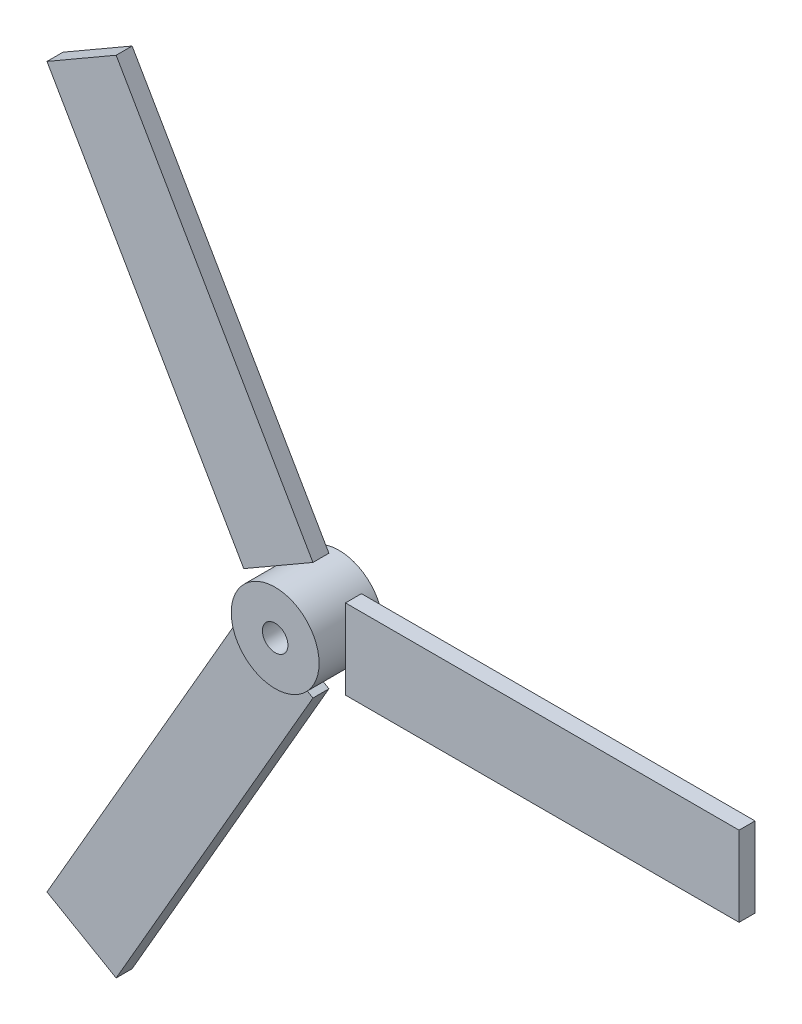
ISO-10303-21;
HEADER;
FILE_DESCRIPTION(('STEP AP214'),'2;1');
FILE_NAME('part.step','',(''),(''),'','','');
FILE_SCHEMA(('AUTOMOTIVE_DESIGN { 1 0 10303 214 1 1 1 1 }'));
ENDSEC;
DATA;
#1=APPLICATION_CONTEXT('core data for automotive mechanical design processes');
#2=APPLICATION_PROTOCOL_DEFINITION('international standard','automotive_design',2000,#1);
#3=PRODUCT_CONTEXT('',#1,'mechanical');
#4=PRODUCT('Part','Part','',(#3));
#5=PRODUCT_RELATED_PRODUCT_CATEGORY('part','',(#4));
#6=PRODUCT_DEFINITION_FORMATION('','',#4);
#7=PRODUCT_DEFINITION_CONTEXT('part definition',#1,'design');
#8=PRODUCT_DEFINITION('design','',#6,#7);
#9=PRODUCT_DEFINITION_SHAPE('','',#8);
#10=(LENGTH_UNIT() NAMED_UNIT(*) SI_UNIT(.MILLI.,.METRE.));
#11=(NAMED_UNIT(*) PLANE_ANGLE_UNIT() SI_UNIT($,.RADIAN.));
#12=(NAMED_UNIT(*) SI_UNIT($,.STERADIAN.) SOLID_ANGLE_UNIT());
#13=UNCERTAINTY_MEASURE_WITH_UNIT(LENGTH_MEASURE(1.E-05),#10,'distance_accuracy_value','');
#14=(GEOMETRIC_REPRESENTATION_CONTEXT(3) GLOBAL_UNCERTAINTY_ASSIGNED_CONTEXT((#13)) GLOBAL_UNIT_ASSIGNED_CONTEXT((#10,
#11,#12)) REPRESENTATION_CONTEXT('',''));
#15=CARTESIAN_POINT('',(0.,0.,0.));
#16=DIRECTION('',(0.,0.,1.));
#17=DIRECTION('',(1.,0.,0.));
#18=AXIS2_PLACEMENT_3D('',#15,#16,#17);
#19=CARTESIAN_POINT('',(42.638538905549,42.638538905549,14.3));
#20=DIRECTION('',(0.,0.,1.));
#21=DIRECTION('',(1.,0.,0.));
#22=AXIS2_PLACEMENT_3D('',#19,#20,#21);
#23=PLANE('',#22);
#24=CARTESIAN_POINT('',(42.638538905549,42.638538905549,14.3));
#25=DIRECTION('',(0.,0.,1.));
#26=DIRECTION('',(1.,0.,0.));
#27=AXIS2_PLACEMENT_3D('',#24,#25,#26);
#28=CIRCLE('',#27,0.8);
#29=CARTESIAN_POINT('',(43.438538905549,42.638538905549,14.3));
#30=VERTEX_POINT('',#29);
#31=EDGE_CURVE('P0_E25',#30,#30,#28,.T.);
#32=ORIENTED_EDGE('',*,*,#31,.F.);
#33=EDGE_LOOP('',(#32));
#34=FACE_BOUND('',#33,.T.);
#35=CARTESIAN_POINT('',(42.638538905549,42.638538905549,14.3));
#36=DIRECTION('',(0.,0.,1.));
#37=DIRECTION('',(1.,0.,0.));
#38=AXIS2_PLACEMENT_3D('',#35,#36,#37);
#39=CIRCLE('',#38,2.75);
#40=CARTESIAN_POINT('',(45.388538905549,42.638538905549,14.3));
#41=VERTEX_POINT('',#40);
#42=EDGE_CURVE('P0_E59',#41,#41,#39,.T.);
#43=ORIENTED_EDGE('',*,*,#42,.T.);
#44=EDGE_LOOP('',(#43));
#45=FACE_BOUND('',#44,.T.);
#46=ADVANCED_FACE('P0_F17',(#34,#45),#23,.T.);
#47=CARTESIAN_POINT('',(42.638538905549,42.638538905549,10.3));
#48=DIRECTION('',(0.,0.,1.));
#49=DIRECTION('',(1.,0.,0.));
#50=AXIS2_PLACEMENT_3D('',#47,#48,#49);
#51=PLANE('',#50);
#52=CARTESIAN_POINT('',(42.638538905549,42.638538905549,10.3));
#53=DIRECTION('',(0.,0.,1.));
#54=DIRECTION('',(1.,0.,0.));
#55=AXIS2_PLACEMENT_3D('',#52,#53,#54);
#56=CIRCLE('',#55,0.8);
#57=CARTESIAN_POINT('',(43.438538905549,42.638538905549,10.3));
#58=VERTEX_POINT('',#57);
#59=EDGE_CURVE('P0_E11',#58,#58,#56,.T.);
#60=ORIENTED_EDGE('',*,*,#59,.T.);
#61=EDGE_LOOP('',(#60));
#62=FACE_BOUND('',#61,.T.);
#63=CARTESIAN_POINT('',(42.638538905549,42.638538905549,10.3));
#64=DIRECTION('',(0.,0.,1.));
#65=DIRECTION('',(1.,0.,0.));
#66=AXIS2_PLACEMENT_3D('',#63,#64,#65);
#67=CIRCLE('',#66,2.75);
#68=CARTESIAN_POINT('',(45.388538905549,42.638538905549,10.3));
#69=VERTEX_POINT('',#68);
#70=EDGE_CURVE('P0_E60',#69,#69,#67,.T.);
#71=ORIENTED_EDGE('',*,*,#70,.F.);
#72=EDGE_LOOP('',(#71));
#73=FACE_BOUND('',#72,.T.);
#74=ADVANCED_FACE('P0_F83',(#62,#73),#51,.F.);
#75=CARTESIAN_POINT('',(42.638538905549,42.638538905549,10.3));
#76=DIRECTION('',(0.,0.,-1.));
#77=DIRECTION('',(1.,0.,0.));
#78=AXIS2_PLACEMENT_3D('',#75,#76,#77);
#79=CYLINDRICAL_SURFACE('',#78,0.8);
#80=DIRECTION('',(0.,0.,1.));
#81=VECTOR('',#80,1.);
#82=CARTESIAN_POINT('',(43.438538905549,42.638538905549,10.3));
#83=LINE('',#82,#81);
#84=EDGE_CURVE('P0_E63',#58,#30,#83,.T.);
#85=ORIENTED_EDGE('',*,*,#84,.T.);
#86=ORIENTED_EDGE('',*,*,#31,.T.);
#87=ORIENTED_EDGE('',*,*,#84,.F.);
#88=ORIENTED_EDGE('',*,*,#59,.F.);
#89=EDGE_LOOP('',(#85,#86,#87,#88));
#90=FACE_BOUND('',#89,.T.);
#91=ADVANCED_FACE('P0_F79',(#90),#79,.F.);
#92=CARTESIAN_POINT('',(42.638538905549,42.638538905549,10.3));
#93=DIRECTION('',(0.,0.,-1.));
#94=DIRECTION('',(1.,0.,0.));
#95=AXIS2_PLACEMENT_3D('',#92,#93,#94);
#96=CYLINDRICAL_SURFACE('',#95,2.75);
#97=ORIENTED_EDGE('',*,*,#70,.T.);
#98=DIRECTION('',(0.,0.,1.));
#99=VECTOR('',#98,1.);
#100=CARTESIAN_POINT('',(45.388538905549,42.638538905549,10.3));
#101=LINE('',#100,#99);
#102=EDGE_CURVE('P0_E53',#69,#41,#101,.T.);
#103=ORIENTED_EDGE('',*,*,#102,.T.);
#104=ORIENTED_EDGE('',*,*,#42,.F.);
#105=ORIENTED_EDGE('',*,*,#102,.F.);
#106=EDGE_LOOP('',(#97,#103,#104,#105));
#107=FACE_BOUND('',#106,.T.);
#108=ADVANCED_FACE('P0_F54',(#107),#96,.T.);
#109=CLOSED_SHELL('',(#46,#74,#91,#108));
#110=MANIFOLD_SOLID_BREP('P0_B1',#109);
#111=CARTESIAN_POINT('',(57.758538905549,42.638538905549,12.7));
#112=DIRECTION('',(0.,0.,1.));
#113=DIRECTION('',(1.,0.,0.));
#114=AXIS2_PLACEMENT_3D('',#111,#112,#113);
#115=PLANE('',#114);
#116=DIRECTION('',(1.,0.,0.));
#117=VECTOR('',#116,1.);
#118=CARTESIAN_POINT('',(45.438538905549,40.138538905549,12.7));
#119=LINE('',#118,#117);
#120=CARTESIAN_POINT('',(45.438538905549,40.138538905549,12.7));
#121=VERTEX_POINT('',#120);
#122=CARTESIAN_POINT('',(70.078538905549,40.138538905549,12.7));
#123=VERTEX_POINT('',#122);
#124=EDGE_CURVE('P1_E81',#121,#123,#119,.T.);
#125=ORIENTED_EDGE('',*,*,#124,.T.);
#126=DIRECTION('',(0.,1.,0.));
#127=VECTOR('',#126,1.);
#128=CARTESIAN_POINT('',(70.078538905549,40.138538905549,12.7));
#129=LINE('',#128,#127);
#130=CARTESIAN_POINT('',(70.078538905549,45.138538905549,12.7));
#131=VERTEX_POINT('',#130);
#132=EDGE_CURVE('P1_E103',#123,#131,#129,.T.);
#133=ORIENTED_EDGE('',*,*,#132,.T.);
#134=DIRECTION('',(-1.,0.,0.));
#135=VECTOR('',#134,1.);
#136=CARTESIAN_POINT('',(70.078538905549,45.138538905549,12.7));
#137=LINE('',#136,#135);
#138=CARTESIAN_POINT('',(45.438538905549,45.138538905549,12.7));
#139=VERTEX_POINT('',#138);
#140=EDGE_CURVE('P1_E72',#131,#139,#137,.T.);
#141=ORIENTED_EDGE('',*,*,#140,.T.);
#142=DIRECTION('',(0.,-1.,0.));
#143=VECTOR('',#142,1.);
#144=CARTESIAN_POINT('',(45.438538905549,45.138538905549,12.7));
#145=LINE('',#144,#143);
#146=EDGE_CURVE('P1_E11',#139,#121,#145,.T.);
#147=ORIENTED_EDGE('',*,*,#146,.T.);
#148=EDGE_LOOP('',(#125,#133,#141,#147));
#149=FACE_BOUND('',#148,.T.);
#150=ADVANCED_FACE('P1_F17',(#149),#115,.T.);
#151=CARTESIAN_POINT('',(57.758538905549,42.638538905549,11.7));
#152=DIRECTION('',(0.,0.,1.));
#153=DIRECTION('',(1.,0.,0.));
#154=AXIS2_PLACEMENT_3D('',#151,#152,#153);
#155=PLANE('',#154);
#156=DIRECTION('',(0.,-1.,0.));
#157=VECTOR('',#156,1.);
#158=CARTESIAN_POINT('',(45.438538905549,45.138538905549,11.7));
#159=LINE('',#158,#157);
#160=CARTESIAN_POINT('',(45.438538905549,45.138538905549,11.7));
#161=VERTEX_POINT('',#160);
#162=CARTESIAN_POINT('',(45.438538905549,40.138538905549,11.7));
#163=VERTEX_POINT('',#162);
#164=EDGE_CURVE('P1_E25',#161,#163,#159,.T.);
#165=ORIENTED_EDGE('',*,*,#164,.F.);
#166=DIRECTION('',(-1.,0.,0.));
#167=VECTOR('',#166,1.);
#168=CARTESIAN_POINT('',(70.078538905549,45.138538905549,11.7));
#169=LINE('',#168,#167);
#170=CARTESIAN_POINT('',(70.078538905549,45.138538905549,11.7));
#171=VERTEX_POINT('',#170);
#172=EDGE_CURVE('P1_E110',#171,#161,#169,.T.);
#173=ORIENTED_EDGE('',*,*,#172,.F.);
#174=DIRECTION('',(0.,1.,0.));
#175=VECTOR('',#174,1.);
#176=CARTESIAN_POINT('',(70.078538905549,40.138538905549,11.7));
#177=LINE('',#176,#175);
#178=CARTESIAN_POINT('',(70.078538905549,40.138538905549,11.7));
#179=VERTEX_POINT('',#178);
#180=EDGE_CURVE('P1_E83',#179,#171,#177,.T.);
#181=ORIENTED_EDGE('',*,*,#180,.F.);
#182=DIRECTION('',(1.,0.,0.));
#183=VECTOR('',#182,1.);
#184=CARTESIAN_POINT('',(45.438538905549,40.138538905549,11.7));
#185=LINE('',#184,#183);
#186=EDGE_CURVE('P1_E78',#163,#179,#185,.T.);
#187=ORIENTED_EDGE('',*,*,#186,.F.);
#188=EDGE_LOOP('',(#165,#173,#181,#187));
#189=FACE_BOUND('',#188,.T.);
#190=ADVANCED_FACE('P1_F84',(#189),#155,.F.);
#191=CARTESIAN_POINT('',(45.438538905549,45.138538905549,11.7));
#192=DIRECTION('',(1.,0.,0.));
#193=DIRECTION('',(0.,1.,0.));
#194=AXIS2_PLACEMENT_3D('',#191,#192,#193);
#195=PLANE('',#194);
#196=ORIENTED_EDGE('',*,*,#164,.T.);
#197=DIRECTION('',(0.,0.,1.));
#198=VECTOR('',#197,1.);
#199=CARTESIAN_POINT('',(45.438538905549,40.138538905549,11.7));
#200=LINE('',#199,#198);
#201=EDGE_CURVE('P1_E68',#163,#121,#200,.T.);
#202=ORIENTED_EDGE('',*,*,#201,.T.);
#203=ORIENTED_EDGE('',*,*,#146,.F.);
#204=DIRECTION('',(0.,0.,1.));
#205=VECTOR('',#204,1.);
#206=CARTESIAN_POINT('',(45.438538905549,45.138538905549,11.7));
#207=LINE('',#206,#205);
#208=EDGE_CURVE('P1_E75',#161,#139,#207,.T.);
#209=ORIENTED_EDGE('',*,*,#208,.F.);
#210=EDGE_LOOP('',(#196,#202,#203,#209));
#211=FACE_BOUND('',#210,.T.);
#212=ADVANCED_FACE('P1_F70',(#211),#195,.F.);
#213=CARTESIAN_POINT('',(70.078538905549,45.138538905549,11.7));
#214=DIRECTION('',(0.,-1.,0.));
#215=DIRECTION('',(0.,0.,-1.));
#216=AXIS2_PLACEMENT_3D('',#213,#214,#215);
#217=PLANE('',#216);
#218=ORIENTED_EDGE('',*,*,#172,.T.);
#219=ORIENTED_EDGE('',*,*,#208,.T.);
#220=ORIENTED_EDGE('',*,*,#140,.F.);
#221=DIRECTION('',(0.,0.,1.));
#222=VECTOR('',#221,1.);
#223=CARTESIAN_POINT('',(70.078538905549,45.138538905549,11.7));
#224=LINE('',#223,#222);
#225=EDGE_CURVE('P1_E97',#171,#131,#224,.T.);
#226=ORIENTED_EDGE('',*,*,#225,.F.);
#227=EDGE_LOOP('',(#218,#219,#220,#226));
#228=FACE_BOUND('',#227,.T.);
#229=ADVANCED_FACE('P1_F117',(#228),#217,.F.);
#230=CARTESIAN_POINT('',(70.078538905549,40.138538905549,11.7));
#231=DIRECTION('',(-1.,0.,0.));
#232=DIRECTION('',(0.,0.,1.));
#233=AXIS2_PLACEMENT_3D('',#230,#231,#232);
#234=PLANE('',#233);
#235=ORIENTED_EDGE('',*,*,#180,.T.);
#236=ORIENTED_EDGE('',*,*,#225,.T.);
#237=ORIENTED_EDGE('',*,*,#132,.F.);
#238=DIRECTION('',(0.,0.,1.));
#239=VECTOR('',#238,1.);
#240=CARTESIAN_POINT('',(70.078538905549,40.138538905549,11.7));
#241=LINE('',#240,#239);
#242=EDGE_CURVE('P1_E90',#179,#123,#241,.T.);
#243=ORIENTED_EDGE('',*,*,#242,.F.);
#244=EDGE_LOOP('',(#235,#236,#237,#243));
#245=FACE_BOUND('',#244,.T.);
#246=ADVANCED_FACE('P1_F118',(#245),#234,.F.);
#247=CARTESIAN_POINT('',(45.438538905549,40.138538905549,11.7));
#248=DIRECTION('',(0.,1.,0.));
#249=DIRECTION('',(1.,0.,0.));
#250=AXIS2_PLACEMENT_3D('',#247,#248,#249);
#251=PLANE('',#250);
#252=ORIENTED_EDGE('',*,*,#186,.T.);
#253=ORIENTED_EDGE('',*,*,#242,.T.);
#254=ORIENTED_EDGE('',*,*,#124,.F.);
#255=ORIENTED_EDGE('',*,*,#201,.F.);
#256=EDGE_LOOP('',(#252,#253,#254,#255));
#257=FACE_BOUND('',#256,.T.);
#258=ADVANCED_FACE('P1_F80',(#257),#251,.F.);
#259=CLOSED_SHELL('',(#150,#190,#212,#229,#246,#258));
#260=MANIFOLD_SOLID_BREP('P1_B1',#259);
#261=CARTESIAN_POINT('',(35.078538905549,55.73284301077,12.7));
#262=DIRECTION('',(0.,0.,1.));
#263=DIRECTION('',(1.,0.,0.));
#264=AXIS2_PLACEMENT_3D('',#261,#262,#263);
#265=PLANE('',#264);
#266=DIRECTION('',(-0.50000000000019,0.866025403784329,0.));
#267=VECTOR('',#266,1.);
#268=CARTESIAN_POINT('',(43.40360241501,46.313410036145,12.7));
#269=LINE('',#268,#267);
#270=CARTESIAN_POINT('',(43.40360241501,46.313410036145,12.7));
#271=VERTEX_POINT('',#270);
#272=CARTESIAN_POINT('',(31.08360241501,67.652275985394,12.7));
#273=VERTEX_POINT('',#272);
#274=EDGE_CURVE('P2_E82',#271,#273,#269,.T.);
#275=ORIENTED_EDGE('',*,*,#274,.T.);
#276=DIRECTION('',(-0.866025403784329,-0.50000000000019,0.));
#277=VECTOR('',#276,1.);
#278=CARTESIAN_POINT('',(31.08360241501,67.652275985394,12.7));
#279=LINE('',#278,#277);
#280=CARTESIAN_POINT('',(26.753475396088,65.152275985394,12.7));
#281=VERTEX_POINT('',#280);
#282=EDGE_CURVE('P2_E85',#273,#281,#279,.T.);
#283=ORIENTED_EDGE('',*,*,#282,.T.);
#284=DIRECTION('',(0.50000000000019,-0.866025403784329,0.));
#285=VECTOR('',#284,1.);
#286=CARTESIAN_POINT('',(26.753475396088,65.152275985394,12.7));
#287=LINE('',#286,#285);
#288=CARTESIAN_POINT('',(39.073475396088,43.813410036145,12.7));
#289=VERTEX_POINT('',#288);
#290=EDGE_CURVE('P2_E71',#281,#289,#287,.T.);
#291=ORIENTED_EDGE('',*,*,#290,.T.);
#292=DIRECTION('',(0.866025403784329,0.50000000000019,0.));
#293=VECTOR('',#292,1.);
#294=CARTESIAN_POINT('',(39.073475396088,43.813410036145,12.7));
#295=LINE('',#294,#293);
#296=EDGE_CURVE('P2_E11',#289,#271,#295,.T.);
#297=ORIENTED_EDGE('',*,*,#296,.T.);
#298=EDGE_LOOP('',(#275,#283,#291,#297));
#299=FACE_BOUND('',#298,.T.);
#300=ADVANCED_FACE('P2_F17',(#299),#265,.T.);
#301=CARTESIAN_POINT('',(35.078538905549,55.73284301077,11.7));
#302=DIRECTION('',(0.,0.,1.));
#303=DIRECTION('',(1.,0.,0.));
#304=AXIS2_PLACEMENT_3D('',#301,#302,#303);
#305=PLANE('',#304);
#306=DIRECTION('',(0.866025403784329,0.50000000000019,0.));
#307=VECTOR('',#306,1.);
#308=CARTESIAN_POINT('',(39.073475396088,43.813410036145,11.7));
#309=LINE('',#308,#307);
#310=CARTESIAN_POINT('',(39.073475396088,43.813410036145,11.7));
#311=VERTEX_POINT('',#310);
#312=CARTESIAN_POINT('',(43.40360241501,46.313410036145,11.7));
#313=VERTEX_POINT('',#312);
#314=EDGE_CURVE('P2_E30',#311,#313,#309,.T.);
#315=ORIENTED_EDGE('',*,*,#314,.F.);
#316=DIRECTION('',(0.50000000000019,-0.866025403784329,0.));
#317=VECTOR('',#316,1.);
#318=CARTESIAN_POINT('',(26.753475396088,65.152275985394,11.7));
#319=LINE('',#318,#317);
#320=CARTESIAN_POINT('',(26.753475396088,65.152275985394,11.7));
#321=VERTEX_POINT('',#320);
#322=EDGE_CURVE('P2_E65',#321,#311,#319,.T.);
#323=ORIENTED_EDGE('',*,*,#322,.F.);
#324=DIRECTION('',(-0.866025403784329,-0.50000000000019,0.));
#325=VECTOR('',#324,1.);
#326=CARTESIAN_POINT('',(31.08360241501,67.652275985394,11.7));
#327=LINE('',#326,#325);
#328=CARTESIAN_POINT('',(31.08360241501,67.652275985394,11.7));
#329=VERTEX_POINT('',#328);
#330=EDGE_CURVE('P2_E93',#329,#321,#327,.T.);
#331=ORIENTED_EDGE('',*,*,#330,.F.);
#332=DIRECTION('',(-0.50000000000019,0.866025403784329,0.));
#333=VECTOR('',#332,1.);
#334=CARTESIAN_POINT('',(43.40360241501,46.313410036145,11.7));
#335=LINE('',#334,#333);
#336=EDGE_CURVE('P2_E107',#313,#329,#335,.T.);
#337=ORIENTED_EDGE('',*,*,#336,.F.);
#338=EDGE_LOOP('',(#315,#323,#331,#337));
#339=FACE_BOUND('',#338,.T.);
#340=ADVANCED_FACE('P2_F109',(#339),#305,.F.);
#341=CARTESIAN_POINT('',(39.073475396088,43.813410036145,11.7));
#342=DIRECTION('',(-0.50000000000019,0.866025403784329,0.));
#343=DIRECTION('',(0.,0.,1.));
#344=AXIS2_PLACEMENT_3D('',#341,#342,#343);
#345=PLANE('',#344);
#346=ORIENTED_EDGE('',*,*,#314,.T.);
#347=DIRECTION('',(0.,0.,1.));
#348=VECTOR('',#347,1.);
#349=CARTESIAN_POINT('',(43.40360241501,46.313410036145,11.7));
#350=LINE('',#349,#348);
#351=EDGE_CURVE('P2_E96',#313,#271,#350,.T.);
#352=ORIENTED_EDGE('',*,*,#351,.T.);
#353=ORIENTED_EDGE('',*,*,#296,.F.);
#354=DIRECTION('',(0.,0.,1.));
#355=VECTOR('',#354,1.);
#356=CARTESIAN_POINT('',(39.073475396088,43.813410036145,11.7));
#357=LINE('',#356,#355);
#358=EDGE_CURVE('P2_E20',#311,#289,#357,.T.);
#359=ORIENTED_EDGE('',*,*,#358,.F.);
#360=EDGE_LOOP('',(#346,#352,#353,#359));
#361=FACE_BOUND('',#360,.T.);
#362=ADVANCED_FACE('P2_F103',(#361),#345,.F.);
#363=CARTESIAN_POINT('',(26.753475396088,65.152275985394,11.7));
#364=DIRECTION('',(0.866025403784329,0.50000000000019,0.));
#365=DIRECTION('',(0.,0.,-1.));
#366=AXIS2_PLACEMENT_3D('',#363,#364,#365);
#367=PLANE('',#366);
#368=ORIENTED_EDGE('',*,*,#322,.T.);
#369=ORIENTED_EDGE('',*,*,#358,.T.);
#370=ORIENTED_EDGE('',*,*,#290,.F.);
#371=DIRECTION('',(0.,0.,1.));
#372=VECTOR('',#371,1.);
#373=CARTESIAN_POINT('',(26.753475396088,65.152275985394,11.7));
#374=LINE('',#373,#372);
#375=EDGE_CURVE('P2_E76',#321,#281,#374,.T.);
#376=ORIENTED_EDGE('',*,*,#375,.F.);
#377=EDGE_LOOP('',(#368,#369,#370,#376));
#378=FACE_BOUND('',#377,.T.);
#379=ADVANCED_FACE('P2_F72',(#378),#367,.F.);
#380=CARTESIAN_POINT('',(31.08360241501,67.652275985394,11.7));
#381=DIRECTION('',(0.50000000000019,-0.866025403784329,0.));
#382=DIRECTION('',(0.,0.,-1.));
#383=AXIS2_PLACEMENT_3D('',#380,#381,#382);
#384=PLANE('',#383);
#385=ORIENTED_EDGE('',*,*,#330,.T.);
#386=ORIENTED_EDGE('',*,*,#375,.T.);
#387=ORIENTED_EDGE('',*,*,#282,.F.);
#388=DIRECTION('',(0.,0.,1.));
#389=VECTOR('',#388,1.);
#390=CARTESIAN_POINT('',(31.08360241501,67.652275985394,11.7));
#391=LINE('',#390,#389);
#392=EDGE_CURVE('P2_E115',#329,#273,#391,.T.);
#393=ORIENTED_EDGE('',*,*,#392,.F.);
#394=EDGE_LOOP('',(#385,#386,#387,#393));
#395=FACE_BOUND('',#394,.T.);
#396=ADVANCED_FACE('P2_F89',(#395),#384,.F.);
#397=CARTESIAN_POINT('',(43.40360241501,46.313410036145,11.7));
#398=DIRECTION('',(-0.866025403784329,-0.50000000000019,0.));
#399=DIRECTION('',(-0.50000000000019,0.866025403784329,0.));
#400=AXIS2_PLACEMENT_3D('',#397,#398,#399);
#401=PLANE('',#400);
#402=ORIENTED_EDGE('',*,*,#336,.T.);
#403=ORIENTED_EDGE('',*,*,#392,.T.);
#404=ORIENTED_EDGE('',*,*,#274,.F.);
#405=ORIENTED_EDGE('',*,*,#351,.F.);
#406=EDGE_LOOP('',(#402,#403,#404,#405));
#407=FACE_BOUND('',#406,.T.);
#408=ADVANCED_FACE('P2_F110',(#407),#401,.F.);
#409=CLOSED_SHELL('',(#300,#340,#362,#379,#396,#408));
#410=MANIFOLD_SOLID_BREP('P2_B1',#409);
#411=CARTESIAN_POINT('',(35.078538905549,29.544234800328,12.7));
#412=DIRECTION('',(0.,0.,1.));
#413=DIRECTION('',(1.,0.,0.));
#414=AXIS2_PLACEMENT_3D('',#411,#412,#413);
#415=PLANE('',#414);
#416=DIRECTION('',(-0.50000000000019,-0.866025403784329,0.));
#417=VECTOR('',#416,1.);
#418=CARTESIAN_POINT('',(39.073475396088,41.463667774952,12.7));
#419=LINE('',#418,#417);
#420=CARTESIAN_POINT('',(39.073475396088,41.463667774952,12.7));
#421=VERTEX_POINT('',#420);
#422=CARTESIAN_POINT('',(26.753475396088,20.124801825704,12.7));
#423=VERTEX_POINT('',#422);
#424=EDGE_CURVE('P3_E96',#421,#423,#419,.T.);
#425=ORIENTED_EDGE('',*,*,#424,.T.);
#426=DIRECTION('',(0.866025403784329,-0.50000000000019,0.));
#427=VECTOR('',#426,1.);
#428=CARTESIAN_POINT('',(26.753475396088,20.124801825704,12.7));
#429=LINE('',#428,#427);
#430=CARTESIAN_POINT('',(31.08360241501,17.624801825704,12.7));
#431=VERTEX_POINT('',#430);
#432=EDGE_CURVE('P3_E76',#423,#431,#429,.T.);
#433=ORIENTED_EDGE('',*,*,#432,.T.);
#434=DIRECTION('',(0.50000000000019,0.866025403784329,0.));
#435=VECTOR('',#434,1.);
#436=CARTESIAN_POINT('',(31.08360241501,17.624801825704,12.7));
#437=LINE('',#436,#435);
#438=CARTESIAN_POINT('',(43.40360241501,38.963667774952,12.7));
#439=VERTEX_POINT('',#438);
#440=EDGE_CURVE('P3_E81',#431,#439,#437,.T.);
#441=ORIENTED_EDGE('',*,*,#440,.T.);
#442=DIRECTION('',(-0.866025403784329,0.50000000000019,0.));
#443=VECTOR('',#442,1.);
#444=CARTESIAN_POINT('',(43.40360241501,38.963667774952,12.7));
#445=LINE('',#444,#443);
#446=EDGE_CURVE('P3_E10',#439,#421,#445,.T.);
#447=ORIENTED_EDGE('',*,*,#446,.T.);
#448=EDGE_LOOP('',(#425,#433,#441,#447));
#449=FACE_BOUND('',#448,.T.);
#450=ADVANCED_FACE('P3_F16',(#449),#415,.T.);
#451=CARTESIAN_POINT('',(35.078538905549,29.544234800328,11.7));
#452=DIRECTION('',(0.,0.,1.));
#453=DIRECTION('',(1.,0.,0.));
#454=AXIS2_PLACEMENT_3D('',#451,#452,#453);
#455=PLANE('',#454);
#456=DIRECTION('',(-0.866025403784329,0.50000000000019,0.));
#457=VECTOR('',#456,1.);
#458=CARTESIAN_POINT('',(43.40360241501,38.963667774952,11.7));
#459=LINE('',#458,#457);
#460=CARTESIAN_POINT('',(43.40360241501,38.963667774952,11.7));
#461=VERTEX_POINT('',#460);
#462=CARTESIAN_POINT('',(39.073475396088,41.463667774952,11.7));
#463=VERTEX_POINT('',#462);
#464=EDGE_CURVE('P3_E19',#461,#463,#459,.T.);
#465=ORIENTED_EDGE('',*,*,#464,.F.);
#466=DIRECTION('',(0.50000000000019,0.866025403784329,0.));
#467=VECTOR('',#466,1.);
#468=CARTESIAN_POINT('',(31.08360241501,17.624801825704,11.7));
#469=LINE('',#468,#467);
#470=CARTESIAN_POINT('',(31.08360241501,17.624801825704,11.7));
#471=VERTEX_POINT('',#470);
#472=EDGE_CURVE('P3_E66',#471,#461,#469,.T.);
#473=ORIENTED_EDGE('',*,*,#472,.F.);
#474=DIRECTION('',(0.866025403784329,-0.50000000000019,0.));
#475=VECTOR('',#474,1.);
#476=CARTESIAN_POINT('',(26.753475396088,20.124801825704,11.7));
#477=LINE('',#476,#475);
#478=CARTESIAN_POINT('',(26.753475396088,20.124801825704,11.7));
#479=VERTEX_POINT('',#478);
#480=EDGE_CURVE('P3_E69',#479,#471,#477,.T.);
#481=ORIENTED_EDGE('',*,*,#480,.F.);
#482=DIRECTION('',(-0.50000000000019,-0.866025403784329,0.));
#483=VECTOR('',#482,1.);
#484=CARTESIAN_POINT('',(39.073475396088,41.463667774952,11.7));
#485=LINE('',#484,#483);
#486=EDGE_CURVE('P3_E108',#463,#479,#485,.T.);
#487=ORIENTED_EDGE('',*,*,#486,.F.);
#488=EDGE_LOOP('',(#465,#473,#481,#487));
#489=FACE_BOUND('',#488,.T.);
#490=ADVANCED_FACE('P3_F68',(#489),#455,.F.);
#491=CARTESIAN_POINT('',(43.40360241501,38.963667774952,11.7));
#492=DIRECTION('',(-0.50000000000019,-0.866025403784329,0.));
#493=DIRECTION('',(-0.866025403784329,0.50000000000019,0.));
#494=AXIS2_PLACEMENT_3D('',#491,#492,#493);
#495=PLANE('',#494);
#496=ORIENTED_EDGE('',*,*,#464,.T.);
#497=DIRECTION('',(0.,0.,1.));
#498=VECTOR('',#497,1.);
#499=CARTESIAN_POINT('',(39.073475396088,41.463667774952,11.7));
#500=LINE('',#499,#498);
#501=EDGE_CURVE('P3_E93',#463,#421,#500,.T.);
#502=ORIENTED_EDGE('',*,*,#501,.T.);
#503=ORIENTED_EDGE('',*,*,#446,.F.);
#504=DIRECTION('',(0.,0.,1.));
#505=VECTOR('',#504,1.);
#506=CARTESIAN_POINT('',(43.40360241501,38.963667774952,11.7));
#507=LINE('',#506,#505);
#508=EDGE_CURVE('P3_E74',#461,#439,#507,.T.);
#509=ORIENTED_EDGE('',*,*,#508,.F.);
#510=EDGE_LOOP('',(#496,#502,#503,#509));
#511=FACE_BOUND('',#510,.T.);
#512=ADVANCED_FACE('P3_F120',(#511),#495,.F.);
#513=CARTESIAN_POINT('',(31.08360241501,17.624801825704,11.7));
#514=DIRECTION('',(-0.866025403784329,0.50000000000019,0.));
#515=DIRECTION('',(0.,0.,1.));
#516=AXIS2_PLACEMENT_3D('',#513,#514,#515);
#517=PLANE('',#516);
#518=ORIENTED_EDGE('',*,*,#472,.T.);
#519=ORIENTED_EDGE('',*,*,#508,.T.);
#520=ORIENTED_EDGE('',*,*,#440,.F.);
#521=DIRECTION('',(0.,0.,1.));
#522=VECTOR('',#521,1.);
#523=CARTESIAN_POINT('',(31.08360241501,17.624801825704,11.7));
#524=LINE('',#523,#522);
#525=EDGE_CURVE('P3_E78',#471,#431,#524,.T.);
#526=ORIENTED_EDGE('',*,*,#525,.F.);
#527=EDGE_LOOP('',(#518,#519,#520,#526));
#528=FACE_BOUND('',#527,.T.);
#529=ADVANCED_FACE('P3_F79',(#528),#517,.F.);
#530=CARTESIAN_POINT('',(26.753475396088,20.124801825704,11.7));
#531=DIRECTION('',(0.50000000000019,0.866025403784329,0.));
#532=DIRECTION('',(0.,0.,-1.));
#533=AXIS2_PLACEMENT_3D('',#530,#531,#532);
#534=PLANE('',#533);
#535=ORIENTED_EDGE('',*,*,#480,.T.);
#536=ORIENTED_EDGE('',*,*,#525,.T.);
#537=ORIENTED_EDGE('',*,*,#432,.F.);
#538=DIRECTION('',(0.,0.,1.));
#539=VECTOR('',#538,1.);
#540=CARTESIAN_POINT('',(26.753475396088,20.124801825704,11.7));
#541=LINE('',#540,#539);
#542=EDGE_CURVE('P3_E86',#479,#423,#541,.T.);
#543=ORIENTED_EDGE('',*,*,#542,.F.);
#544=EDGE_LOOP('',(#535,#536,#537,#543));
#545=FACE_BOUND('',#544,.T.);
#546=ADVANCED_FACE('P3_F88',(#545),#534,.F.);
#547=CARTESIAN_POINT('',(39.073475396088,41.463667774952,11.7));
#548=DIRECTION('',(0.866025403784329,-0.50000000000019,0.));
#549=DIRECTION('',(0.,0.,-1.));
#550=AXIS2_PLACEMENT_3D('',#547,#548,#549);
#551=PLANE('',#550);
#552=ORIENTED_EDGE('',*,*,#486,.T.);
#553=ORIENTED_EDGE('',*,*,#542,.T.);
#554=ORIENTED_EDGE('',*,*,#424,.F.);
#555=ORIENTED_EDGE('',*,*,#501,.F.);
#556=EDGE_LOOP('',(#552,#553,#554,#555));
#557=FACE_BOUND('',#556,.T.);
#558=ADVANCED_FACE('P3_F118',(#557),#551,.F.);
#559=CLOSED_SHELL('',(#450,#490,#512,#529,#546,#558));
#560=MANIFOLD_SOLID_BREP('P3_B1',#559);
#561=ADVANCED_BREP_SHAPE_REPRESENTATION('',(#18,#110,#260,#410,#560),#14);
#562=SHAPE_DEFINITION_REPRESENTATION(#9,#561);
ENDSEC;
END-ISO-10303-21;
